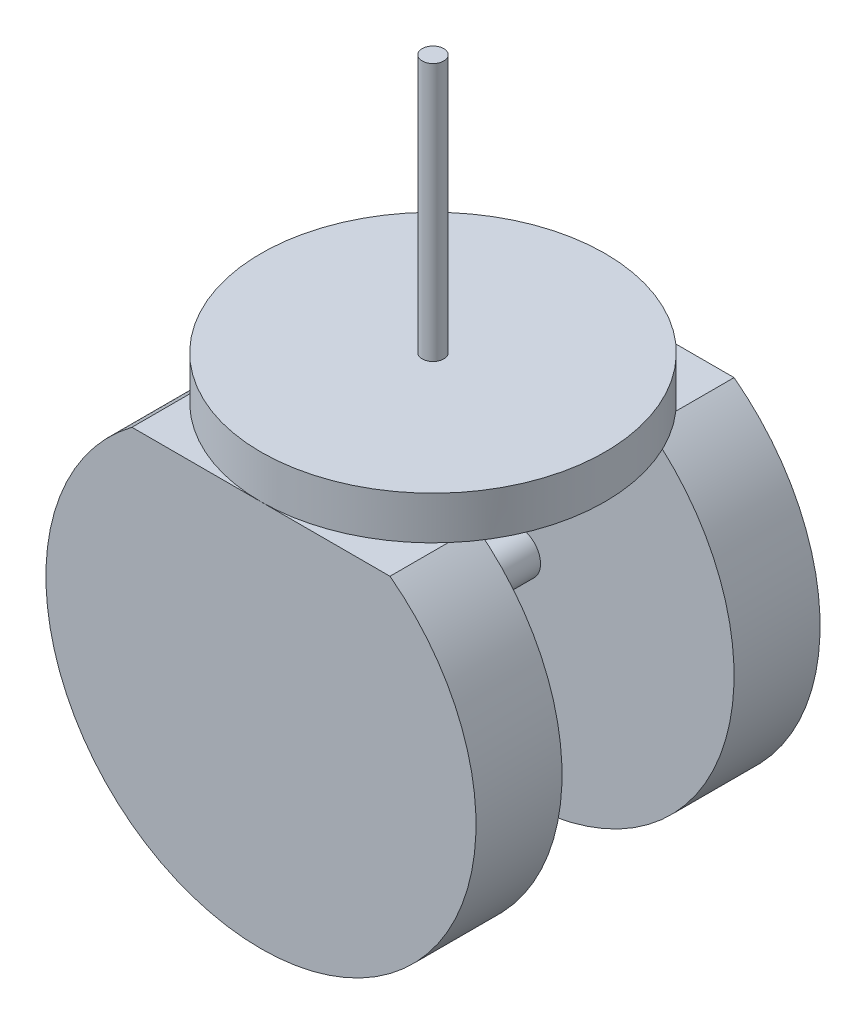
ISO-10303-21;
HEADER;
FILE_DESCRIPTION(('STEP AP214'),'2;1');
FILE_NAME('part.step','',(''),(''),'','','');
FILE_SCHEMA(('AUTOMOTIVE_DESIGN { 1 0 10303 214 1 1 1 1 }'));
ENDSEC;
DATA;
#1=APPLICATION_CONTEXT('core data for automotive mechanical design processes');
#2=APPLICATION_PROTOCOL_DEFINITION('international standard','automotive_design',2000,#1);
#3=PRODUCT_CONTEXT('',#1,'mechanical');
#4=PRODUCT('Part','Part','',(#3));
#5=PRODUCT_RELATED_PRODUCT_CATEGORY('part','',(#4));
#6=PRODUCT_DEFINITION_FORMATION('','',#4);
#7=PRODUCT_DEFINITION_CONTEXT('part definition',#1,'design');
#8=PRODUCT_DEFINITION('design','',#6,#7);
#9=PRODUCT_DEFINITION_SHAPE('','',#8);
#10=(LENGTH_UNIT() NAMED_UNIT(*) SI_UNIT(.MILLI.,.METRE.));
#11=(NAMED_UNIT(*) PLANE_ANGLE_UNIT() SI_UNIT($,.RADIAN.));
#12=(NAMED_UNIT(*) SI_UNIT($,.STERADIAN.) SOLID_ANGLE_UNIT());
#13=UNCERTAINTY_MEASURE_WITH_UNIT(LENGTH_MEASURE(1.E-05),#10,'distance_accuracy_value','');
#14=(GEOMETRIC_REPRESENTATION_CONTEXT(3) GLOBAL_UNCERTAINTY_ASSIGNED_CONTEXT((#13)) GLOBAL_UNIT_ASSIGNED_CONTEXT((#10,
#11,#12)) REPRESENTATION_CONTEXT('',''));
#15=CARTESIAN_POINT('',(0.,0.,0.));
#16=DIRECTION('',(0.,0.,1.));
#17=DIRECTION('',(1.,0.,0.));
#18=AXIS2_PLACEMENT_3D('',#15,#16,#17);
#19=CARTESIAN_POINT('',(0.,50.8,0.));
#20=DIRECTION('',(0.,-1.,0.));
#21=DIRECTION('',(0.,0.,-1.));
#22=AXIS2_PLACEMENT_3D('',#19,#20,#21);
#23=PLANE('',#22);
#24=CARTESIAN_POINT('',(0.,50.8,-25.4));
#25=DIRECTION('',(0.,1.,0.));
#26=DIRECTION('',(0.,0.,1.));
#27=AXIS2_PLACEMENT_3D('',#24,#25,#26);
#28=CIRCLE('',#27,50.8);
#29=CARTESIAN_POINT('',(0.,50.8,-76.2));
#30=VERTEX_POINT('',#29);
#31=CARTESIAN_POINT('',(-38.1,50.8,-59.0010416505203));
#32=VERTEX_POINT('',#31);
#33=EDGE_CURVE('E143',#30,#32,#28,.T.);
#34=ORIENTED_EDGE('',*,*,#33,.F.);
#35=DIRECTION('',(-1.,0.,0.));
#36=VECTOR('',#35,1.);
#37=CARTESIAN_POINT('',(-63.5,50.8,-76.2));
#38=LINE('',#37,#36);
#39=CARTESIAN_POINT('',(-38.1,50.8,-76.2));
#40=VERTEX_POINT('',#39);
#41=EDGE_CURVE('E260',#30,#40,#38,.T.);
#42=ORIENTED_EDGE('',*,*,#41,.T.);
#43=DIRECTION('',(0.,0.,1.));
#44=VECTOR('',#43,1.);
#45=CARTESIAN_POINT('',(-38.1,50.8,-76.2));
#46=LINE('',#45,#44);
#47=EDGE_CURVE('E65',#32,#40,#46,.F.);
#48=ORIENTED_EDGE('',*,*,#47,.F.);
#49=EDGE_LOOP('',(#34,#42,#48));
#50=FACE_BOUND('',#49,.T.);
#51=ADVANCED_FACE('F41',(#50),#23,.F.);
#52=CARTESIAN_POINT('',(0.,50.8,-25.4));
#53=DIRECTION('',(0.,-1.,0.));
#54=DIRECTION('',(0.,0.,-1.));
#55=AXIS2_PLACEMENT_3D('',#52,#53,#54);
#56=CIRCLE('',#55,50.8);
#57=CARTESIAN_POINT('',(-38.1,50.8,8.20104165052028));
#58=VERTEX_POINT('',#57);
#59=CARTESIAN_POINT('',(0.,50.8,25.4));
#60=VERTEX_POINT('',#59);
#61=EDGE_CURVE('E11',#58,#60,#56,.F.);
#62=ORIENTED_EDGE('',*,*,#61,.F.);
#63=DIRECTION('',(0.,0.,-1.));
#64=VECTOR('',#63,1.);
#65=CARTESIAN_POINT('',(-38.1,50.8,25.4));
#66=LINE('',#65,#64);
#67=CARTESIAN_POINT('',(-38.1,50.8,25.4));
#68=VERTEX_POINT('',#67);
#69=EDGE_CURVE('E232',#68,#58,#66,.T.);
#70=ORIENTED_EDGE('',*,*,#69,.F.);
#71=DIRECTION('',(1.,0.,0.));
#72=VECTOR('',#71,1.);
#73=CARTESIAN_POINT('',(-63.5,50.8,25.4));
#74=LINE('',#73,#72);
#75=EDGE_CURVE('E261',#68,#60,#74,.T.);
#76=ORIENTED_EDGE('',*,*,#75,.T.);
#77=EDGE_LOOP('',(#62,#70,#76));
#78=FACE_BOUND('',#77,.T.);
#79=ADVANCED_FACE('F175',(#78),#23,.F.);
#80=CARTESIAN_POINT('',(0.,0.,25.4));
#81=DIRECTION('',(0.,0.,-1.));
#82=DIRECTION('',(-1.,0.,0.));
#83=AXIS2_PLACEMENT_3D('',#80,#81,#82);
#84=CYLINDRICAL_SURFACE('',#83,63.5);
#85=CARTESIAN_POINT('',(0.,0.,25.4));
#86=DIRECTION('',(0.,0.,1.));
#87=DIRECTION('',(1.,0.,0.));
#88=AXIS2_PLACEMENT_3D('',#85,#86,#87);
#89=CIRCLE('',#88,63.5);
#90=CARTESIAN_POINT('',(38.1,50.8,25.4));
#91=VERTEX_POINT('',#90);
#92=EDGE_CURVE('E221',#68,#91,#89,.T.);
#93=ORIENTED_EDGE('',*,*,#92,.F.);
#94=ORIENTED_EDGE('',*,*,#69,.T.);
#95=CARTESIAN_POINT('',(-38.1,50.8,0.));
#96=VERTEX_POINT('',#95);
#97=EDGE_CURVE('E113',#58,#96,#66,.T.);
#98=ORIENTED_EDGE('',*,*,#97,.T.);
#99=CARTESIAN_POINT('',(0.,0.,0.));
#100=DIRECTION('',(0.,0.,1.));
#101=DIRECTION('',(1.,0.,0.));
#102=AXIS2_PLACEMENT_3D('',#99,#100,#101);
#103=CIRCLE('',#102,63.5);
#104=CARTESIAN_POINT('',(38.1,50.8,0.));
#105=VERTEX_POINT('',#104);
#106=EDGE_CURVE('E108',#96,#105,#103,.T.);
#107=ORIENTED_EDGE('',*,*,#106,.T.);
#108=DIRECTION('',(0.,0.,-1.));
#109=VECTOR('',#108,1.);
#110=CARTESIAN_POINT('',(38.1,50.8,25.4));
#111=LINE('',#110,#109);
#112=CARTESIAN_POINT('',(38.1,50.8,8.20104165052028));
#113=VERTEX_POINT('',#112);
#114=EDGE_CURVE('E102',#105,#113,#111,.F.);
#115=ORIENTED_EDGE('',*,*,#114,.T.);
#116=EDGE_CURVE('E105',#113,#91,#111,.F.);
#117=ORIENTED_EDGE('',*,*,#116,.T.);
#118=EDGE_LOOP('',(#93,#94,#98,#107,#115,#117));
#119=FACE_BOUND('',#118,.T.);
#120=ADVANCED_FACE('F43',(#119),#84,.T.);
#121=CARTESIAN_POINT('',(0.,0.,25.4));
#122=DIRECTION('',(0.,0.,1.));
#123=DIRECTION('',(1.,0.,0.));
#124=AXIS2_PLACEMENT_3D('',#121,#122,#123);
#125=PLANE('',#124);
#126=ORIENTED_EDGE('',*,*,#75,.F.);
#127=ORIENTED_EDGE('',*,*,#92,.T.);
#128=EDGE_CURVE('E120',#60,#91,#74,.T.);
#129=ORIENTED_EDGE('',*,*,#128,.F.);
#130=EDGE_LOOP('',(#126,#127,#129));
#131=FACE_BOUND('',#130,.T.);
#132=ADVANCED_FACE('F209',(#131),#125,.T.);
#133=CARTESIAN_POINT('',(0.,0.,0.));
#134=DIRECTION('',(0.,0.,1.));
#135=DIRECTION('',(1.,0.,0.));
#136=AXIS2_PLACEMENT_3D('',#133,#134,#135);
#137=PLANE('',#136);
#138=CARTESIAN_POINT('',(0.,0.,0.));
#139=DIRECTION('',(0.,0.,1.));
#140=DIRECTION('',(1.,0.,0.));
#141=AXIS2_PLACEMENT_3D('',#138,#139,#140);
#142=CIRCLE('',#141,6.35);
#143=CARTESIAN_POINT('',(6.35,0.,0.));
#144=VERTEX_POINT('',#143);
#145=EDGE_CURVE('E219',#144,#144,#142,.F.);
#146=ORIENTED_EDGE('',*,*,#145,.F.);
#147=EDGE_LOOP('',(#146));
#148=FACE_BOUND('',#147,.T.);
#149=ORIENTED_EDGE('',*,*,#106,.F.);
#150=DIRECTION('',(1.,0.,0.));
#151=VECTOR('',#150,1.);
#152=CARTESIAN_POINT('',(0.,50.8,0.));
#153=LINE('',#152,#151);
#154=EDGE_CURVE('E123',#96,#105,#153,.T.);
#155=ORIENTED_EDGE('',*,*,#154,.T.);
#156=EDGE_LOOP('',(#149,#155));
#157=FACE_BOUND('',#156,.T.);
#158=ADVANCED_FACE('F207',(#148,#157),#137,.F.);
#159=CARTESIAN_POINT('',(0.,0.,-50.8));
#160=DIRECTION('',(0.,0.,1.));
#161=DIRECTION('',(1.,0.,0.));
#162=AXIS2_PLACEMENT_3D('',#159,#160,#161);
#163=CYLINDRICAL_SURFACE('',#162,6.35);
#164=CARTESIAN_POINT('',(0.,0.,-50.8));
#165=DIRECTION('',(0.,0.,-1.));
#166=DIRECTION('',(-1.,0.,0.));
#167=AXIS2_PLACEMENT_3D('',#164,#165,#166);
#168=CIRCLE('',#167,6.35);
#169=CARTESIAN_POINT('',(-6.35,0.,-50.8));
#170=VERTEX_POINT('',#169);
#171=EDGE_CURVE('E222',#170,#170,#168,.T.);
#172=ORIENTED_EDGE('',*,*,#171,.F.);
#173=EDGE_LOOP('',(#172));
#174=FACE_BOUND('',#173,.T.);
#175=ORIENTED_EDGE('',*,*,#145,.T.);
#176=EDGE_LOOP('',(#175));
#177=FACE_BOUND('',#176,.T.);
#178=ADVANCED_FACE('F203',(#174,#177),#163,.T.);
#179=CARTESIAN_POINT('',(0.,0.,-76.2));
#180=DIRECTION('',(0.,0.,1.));
#181=DIRECTION('',(1.,0.,0.));
#182=AXIS2_PLACEMENT_3D('',#179,#180,#181);
#183=CYLINDRICAL_SURFACE('',#182,63.5);
#184=CARTESIAN_POINT('',(0.,0.,-76.2));
#185=DIRECTION('',(0.,0.,-1.));
#186=DIRECTION('',(-1.,0.,0.));
#187=AXIS2_PLACEMENT_3D('',#184,#185,#186);
#188=CIRCLE('',#187,63.5);
#189=CARTESIAN_POINT('',(38.1,50.8,-76.2));
#190=VERTEX_POINT('',#189);
#191=EDGE_CURVE('E237',#190,#40,#188,.T.);
#192=ORIENTED_EDGE('',*,*,#191,.F.);
#193=DIRECTION('',(0.,0.,1.));
#194=VECTOR('',#193,1.);
#195=CARTESIAN_POINT('',(38.1,50.8,-76.2));
#196=LINE('',#195,#194);
#197=CARTESIAN_POINT('',(38.1,50.8,-59.0010416505203));
#198=VERTEX_POINT('',#197);
#199=EDGE_CURVE('E226',#190,#198,#196,.T.);
#200=ORIENTED_EDGE('',*,*,#199,.T.);
#201=CARTESIAN_POINT('',(38.1,50.8,-50.8));
#202=VERTEX_POINT('',#201);
#203=EDGE_CURVE('E129',#198,#202,#196,.T.);
#204=ORIENTED_EDGE('',*,*,#203,.T.);
#205=CARTESIAN_POINT('',(0.,0.,-50.8));
#206=DIRECTION('',(0.,0.,-1.));
#207=DIRECTION('',(-1.,0.,0.));
#208=AXIS2_PLACEMENT_3D('',#205,#206,#207);
#209=CIRCLE('',#208,63.5);
#210=CARTESIAN_POINT('',(-38.1,50.8,-50.8));
#211=VERTEX_POINT('',#210);
#212=EDGE_CURVE('E236',#202,#211,#209,.T.);
#213=ORIENTED_EDGE('',*,*,#212,.T.);
#214=EDGE_CURVE('E253',#211,#32,#46,.F.);
#215=ORIENTED_EDGE('',*,*,#214,.T.);
#216=ORIENTED_EDGE('',*,*,#47,.T.);
#217=EDGE_LOOP('',(#192,#200,#204,#213,#215,#216));
#218=FACE_BOUND('',#217,.T.);
#219=ADVANCED_FACE('F196',(#218),#183,.T.);
#220=CARTESIAN_POINT('',(0.,0.,-76.2));
#221=DIRECTION('',(0.,0.,-1.));
#222=DIRECTION('',(-1.,0.,0.));
#223=AXIS2_PLACEMENT_3D('',#220,#221,#222);
#224=PLANE('',#223);
#225=EDGE_CURVE('E257',#190,#30,#38,.T.);
#226=ORIENTED_EDGE('',*,*,#225,.F.);
#227=ORIENTED_EDGE('',*,*,#191,.T.);
#228=ORIENTED_EDGE('',*,*,#41,.F.);
#229=EDGE_LOOP('',(#226,#227,#228));
#230=FACE_BOUND('',#229,.T.);
#231=ADVANCED_FACE('F190',(#230),#224,.T.);
#232=CARTESIAN_POINT('',(0.,0.,-50.8));
#233=DIRECTION('',(0.,0.,-1.));
#234=DIRECTION('',(-1.,0.,0.));
#235=AXIS2_PLACEMENT_3D('',#232,#233,#234);
#236=PLANE('',#235);
#237=ORIENTED_EDGE('',*,*,#171,.T.);
#238=EDGE_LOOP('',(#237));
#239=FACE_BOUND('',#238,.T.);
#240=ORIENTED_EDGE('',*,*,#212,.F.);
#241=DIRECTION('',(-1.,0.,0.));
#242=VECTOR('',#241,1.);
#243=CARTESIAN_POINT('',(0.,50.8,-50.8));
#244=LINE('',#243,#242);
#245=EDGE_CURVE('E50',#202,#211,#244,.T.);
#246=ORIENTED_EDGE('',*,*,#245,.T.);
#247=EDGE_LOOP('',(#240,#246));
#248=FACE_BOUND('',#247,.T.);
#249=ADVANCED_FACE('F186',(#239,#248),#236,.F.);
#250=EDGE_CURVE('E57',#198,#30,#28,.T.);
#251=ORIENTED_EDGE('',*,*,#250,.F.);
#252=ORIENTED_EDGE('',*,*,#199,.F.);
#253=ORIENTED_EDGE('',*,*,#225,.T.);
#254=EDGE_LOOP('',(#251,#252,#253));
#255=FACE_BOUND('',#254,.T.);
#256=ADVANCED_FACE('F180',(#255),#23,.F.);
#257=EDGE_CURVE('E118',#60,#113,#28,.T.);
#258=ORIENTED_EDGE('',*,*,#257,.F.);
#259=ORIENTED_EDGE('',*,*,#128,.T.);
#260=ORIENTED_EDGE('',*,*,#116,.F.);
#261=EDGE_LOOP('',(#258,#259,#260));
#262=FACE_BOUND('',#261,.T.);
#263=ADVANCED_FACE('F116',(#262),#23,.F.);
#264=CARTESIAN_POINT('',(0.,50.8,-25.4));
#265=DIRECTION('',(0.,1.,0.));
#266=DIRECTION('',(0.,0.,1.));
#267=AXIS2_PLACEMENT_3D('',#264,#265,#266);
#268=PLANE('',#267);
#269=EDGE_CURVE('E126',#113,#198,#28,.T.);
#270=ORIENTED_EDGE('',*,*,#269,.F.);
#271=ORIENTED_EDGE('',*,*,#114,.F.);
#272=ORIENTED_EDGE('',*,*,#154,.F.);
#273=ORIENTED_EDGE('',*,*,#97,.F.);
#274=EDGE_CURVE('E137',#32,#58,#28,.T.);
#275=ORIENTED_EDGE('',*,*,#274,.F.);
#276=ORIENTED_EDGE('',*,*,#214,.F.);
#277=ORIENTED_EDGE('',*,*,#245,.F.);
#278=ORIENTED_EDGE('',*,*,#203,.F.);
#279=EDGE_LOOP('',(#270,#271,#272,#273,#275,#276,#277,#278));
#280=FACE_BOUND('',#279,.T.);
#281=ADVANCED_FACE('F127',(#280),#268,.F.);
#282=CARTESIAN_POINT('',(0.,63.5,-25.4));
#283=DIRECTION('',(0.,-1.,0.));
#284=DIRECTION('',(0.,0.,-1.));
#285=AXIS2_PLACEMENT_3D('',#282,#283,#284);
#286=CYLINDRICAL_SURFACE('',#285,50.8);
#287=CARTESIAN_POINT('',(0.,63.5,-25.4));
#288=DIRECTION('',(0.,1.,0.));
#289=DIRECTION('',(0.,0.,1.));
#290=AXIS2_PLACEMENT_3D('',#287,#288,#289);
#291=CIRCLE('',#290,50.8);
#292=CARTESIAN_POINT('',(0.,63.5,25.4));
#293=VERTEX_POINT('',#292);
#294=EDGE_CURVE('E136',#293,#293,#291,.T.);
#295=ORIENTED_EDGE('',*,*,#294,.F.);
#296=EDGE_LOOP('',(#295));
#297=FACE_BOUND('',#296,.T.);
#298=ORIENTED_EDGE('',*,*,#257,.T.);
#299=ORIENTED_EDGE('',*,*,#269,.T.);
#300=ORIENTED_EDGE('',*,*,#250,.T.);
#301=ORIENTED_EDGE('',*,*,#33,.T.);
#302=ORIENTED_EDGE('',*,*,#274,.T.);
#303=ORIENTED_EDGE('',*,*,#61,.T.);
#304=EDGE_LOOP('',(#298,#299,#300,#301,#302,#303));
#305=FACE_BOUND('',#304,.T.);
#306=ADVANCED_FACE('F133',(#297,#305),#286,.T.);
#307=CARTESIAN_POINT('',(0.,63.5,-25.4));
#308=DIRECTION('',(0.,1.,0.));
#309=DIRECTION('',(0.,0.,1.));
#310=AXIS2_PLACEMENT_3D('',#307,#308,#309);
#311=PLANE('',#310);
#312=CARTESIAN_POINT('',(0.,63.5,-25.4));
#313=DIRECTION('',(0.,1.,0.));
#314=DIRECTION('',(0.,0.,1.));
#315=AXIS2_PLACEMENT_3D('',#312,#313,#314);
#316=CIRCLE('',#315,3.175);
#317=CARTESIAN_POINT('',(0.,63.5,-28.575));
#318=VERTEX_POINT('',#317);
#319=EDGE_CURVE('E150',#318,#318,#316,.T.);
#320=ORIENTED_EDGE('',*,*,#319,.F.);
#321=EDGE_LOOP('',(#320));
#322=FACE_BOUND('',#321,.T.);
#323=ORIENTED_EDGE('',*,*,#294,.T.);
#324=EDGE_LOOP('',(#323));
#325=FACE_BOUND('',#324,.T.);
#326=ADVANCED_FACE('F161',(#322,#325),#311,.T.);
#327=CARTESIAN_POINT('',(0.,139.7,-25.4));
#328=DIRECTION('',(0.,-1.,0.));
#329=DIRECTION('',(0.,0.,-1.));
#330=AXIS2_PLACEMENT_3D('',#327,#328,#329);
#331=CYLINDRICAL_SURFACE('',#330,3.175);
#332=CARTESIAN_POINT('',(0.,139.7,-25.4));
#333=DIRECTION('',(0.,1.,0.));
#334=DIRECTION('',(0.,0.,1.));
#335=AXIS2_PLACEMENT_3D('',#332,#333,#334);
#336=CIRCLE('',#335,3.175);
#337=CARTESIAN_POINT('',(0.,139.7,-28.575));
#338=VERTEX_POINT('',#337);
#339=EDGE_CURVE('E144',#338,#338,#336,.T.);
#340=CARTESIAN_POINT('',(0.,139.7,-28.575));
#341=CARTESIAN_POINT('',(0.,138.90625,-28.575));
#342=CARTESIAN_POINT('',(0.,138.1125,-28.575));
#343=CARTESIAN_POINT('',(0.,136.525,-28.575));
#344=CARTESIAN_POINT('',(0.,135.73125,-28.575));
#345=CARTESIAN_POINT('',(0.,134.14375,-28.575));
#346=CARTESIAN_POINT('',(0.,133.35,-28.575));
#347=CARTESIAN_POINT('',(0.,131.7625,-28.575));
#348=CARTESIAN_POINT('',(0.,130.96875,-28.575));
#349=CARTESIAN_POINT('',(0.,129.38125,-28.575));
#350=CARTESIAN_POINT('',(0.,128.5875,-28.575));
#351=CARTESIAN_POINT('',(0.,127.,-28.575));
#352=CARTESIAN_POINT('',(0.,126.20625,-28.575));
#353=CARTESIAN_POINT('',(0.,124.61875,-28.575));
#354=CARTESIAN_POINT('',(0.,123.825,-28.575));
#355=CARTESIAN_POINT('',(0.,122.2375,-28.575));
#356=CARTESIAN_POINT('',(0.,121.44375,-28.575));
#357=CARTESIAN_POINT('',(0.,119.85625,-28.575));
#358=CARTESIAN_POINT('',(0.,119.0625,-28.575));
#359=CARTESIAN_POINT('',(0.,117.475,-28.575));
#360=CARTESIAN_POINT('',(0.,116.68125,-28.575));
#361=CARTESIAN_POINT('',(0.,115.09375,-28.575));
#362=CARTESIAN_POINT('',(0.,114.3,-28.575));
#363=CARTESIAN_POINT('',(0.,112.7125,-28.575));
#364=CARTESIAN_POINT('',(0.,111.91875,-28.575));
#365=CARTESIAN_POINT('',(0.,110.33125,-28.575));
#366=CARTESIAN_POINT('',(0.,109.5375,-28.575));
#367=CARTESIAN_POINT('',(0.,107.95,-28.575));
#368=CARTESIAN_POINT('',(0.,107.15625,-28.575));
#369=CARTESIAN_POINT('',(0.,105.56875,-28.575));
#370=CARTESIAN_POINT('',(0.,104.775,-28.575));
#371=CARTESIAN_POINT('',(0.,103.1875,-28.575));
#372=CARTESIAN_POINT('',(0.,102.39375,-28.575));
#373=CARTESIAN_POINT('',(0.,100.80625,-28.575));
#374=CARTESIAN_POINT('',(0.,100.0125,-28.575));
#375=CARTESIAN_POINT('',(0.,98.425,-28.575));
#376=CARTESIAN_POINT('',(0.,97.63125,-28.575));
#377=CARTESIAN_POINT('',(0.,96.04375,-28.575));
#378=CARTESIAN_POINT('',(0.,95.25,-28.575));
#379=CARTESIAN_POINT('',(0.,93.6625,-28.575));
#380=CARTESIAN_POINT('',(0.,92.86875,-28.575));
#381=CARTESIAN_POINT('',(0.,91.28125,-28.575));
#382=CARTESIAN_POINT('',(0.,90.4875,-28.575));
#383=CARTESIAN_POINT('',(0.,88.9,-28.575));
#384=CARTESIAN_POINT('',(0.,88.10625,-28.575));
#385=CARTESIAN_POINT('',(0.,86.51875,-28.575));
#386=CARTESIAN_POINT('',(0.,85.725,-28.575));
#387=CARTESIAN_POINT('',(0.,84.1375,-28.575));
#388=CARTESIAN_POINT('',(0.,83.34375,-28.575));
#389=CARTESIAN_POINT('',(0.,81.75625,-28.575));
#390=CARTESIAN_POINT('',(0.,80.9625,-28.575));
#391=CARTESIAN_POINT('',(0.,79.375,-28.575));
#392=CARTESIAN_POINT('',(0.,78.58125,-28.575));
#393=CARTESIAN_POINT('',(0.,76.99375,-28.575));
#394=CARTESIAN_POINT('',(0.,76.2,-28.575));
#395=CARTESIAN_POINT('',(0.,74.6125,-28.575));
#396=CARTESIAN_POINT('',(0.,73.81875,-28.575));
#397=CARTESIAN_POINT('',(0.,72.23125,-28.575));
#398=CARTESIAN_POINT('',(0.,71.4375,-28.575));
#399=CARTESIAN_POINT('',(0.,69.85,-28.575));
#400=CARTESIAN_POINT('',(0.,69.05625,-28.575));
#401=CARTESIAN_POINT('',(0.,67.46875,-28.575));
#402=CARTESIAN_POINT('',(0.,66.675,-28.575));
#403=CARTESIAN_POINT('',(0.,65.0875,-28.575));
#404=CARTESIAN_POINT('',(0.,64.29375,-28.575));
#405=CARTESIAN_POINT('',(0.,63.5,-28.575));
#406=B_SPLINE_CURVE_WITH_KNOTS('',3,(#340,#341,#342,#343,#344,#345,#346,#347,#348,#349,#350,
#351,#352,#353,#354,#355,#356,#357,#358,#359,#360,#361,#362,#363,#364,#365,#366,#367,#368,#369,
#370,#371,#372,#373,#374,#375,#376,#377,#378,#379,#380,#381,#382,#383,#384,#385,#386,#387,#388,
#389,#390,#391,#392,#393,#394,#395,#396,#397,#398,#399,#400,#401,#402,#403,#404,#405),
.UNSPECIFIED.,.F.,.F.,(4,2,2,2,2,2,2,2,2,2,2,2,2,2,2,2,2,2,2,2,2,2,2,2,2,2,2,2,2,2,2,2,4),(0.,
2.38125,4.7625,7.14375,9.52500000000001,11.90625,14.2875,16.66875,19.05,21.43125,23.8125,
26.19375,28.575,30.95625,33.3375,35.71875,38.1,40.48125,42.8625,45.24375,47.625,50.00625,
52.3875,54.76875,57.15,59.53125,61.9125,64.29375,66.675,69.05625,71.4375,73.81875,76.2),.UNSPECIFIED.);
#407=EDGE_CURVE('BSEAM159',#338,#318,#406,.T.);
#408=ORIENTED_EDGE('',*,*,#339,.F.);
#409=ORIENTED_EDGE('',*,*,#319,.T.);
#410=ORIENTED_EDGE('',*,*,#407,.T.);
#411=ORIENTED_EDGE('',*,*,#407,.F.);
#412=EDGE_LOOP('',(#408,#410,#409,#411));
#413=FACE_BOUND('',#412,.T.);
#414=ADVANCED_FACE('F159',(#413),#331,.T.);
#415=CARTESIAN_POINT('',(0.,139.7,-25.4));
#416=DIRECTION('',(0.,1.,0.));
#417=DIRECTION('',(0.,0.,1.));
#418=AXIS2_PLACEMENT_3D('',#415,#416,#417);
#419=PLANE('',#418);
#420=ORIENTED_EDGE('',*,*,#339,.T.);
#421=EDGE_LOOP('',(#420));
#422=FACE_BOUND('',#421,.T.);
#423=ADVANCED_FACE('F328',(#422),#419,.T.);
#424=CLOSED_SHELL('',(#51,#79,#120,#132,#158,#178,#219,#231,#249,#256,#263,#281,#306,#326,#414,#423));
#425=MANIFOLD_SOLID_BREP('B2',#424);
#426=ADVANCED_BREP_SHAPE_REPRESENTATION('',(#18,#425),#14);
#427=SHAPE_DEFINITION_REPRESENTATION(#9,#426);
ENDSEC;
END-ISO-10303-21;
